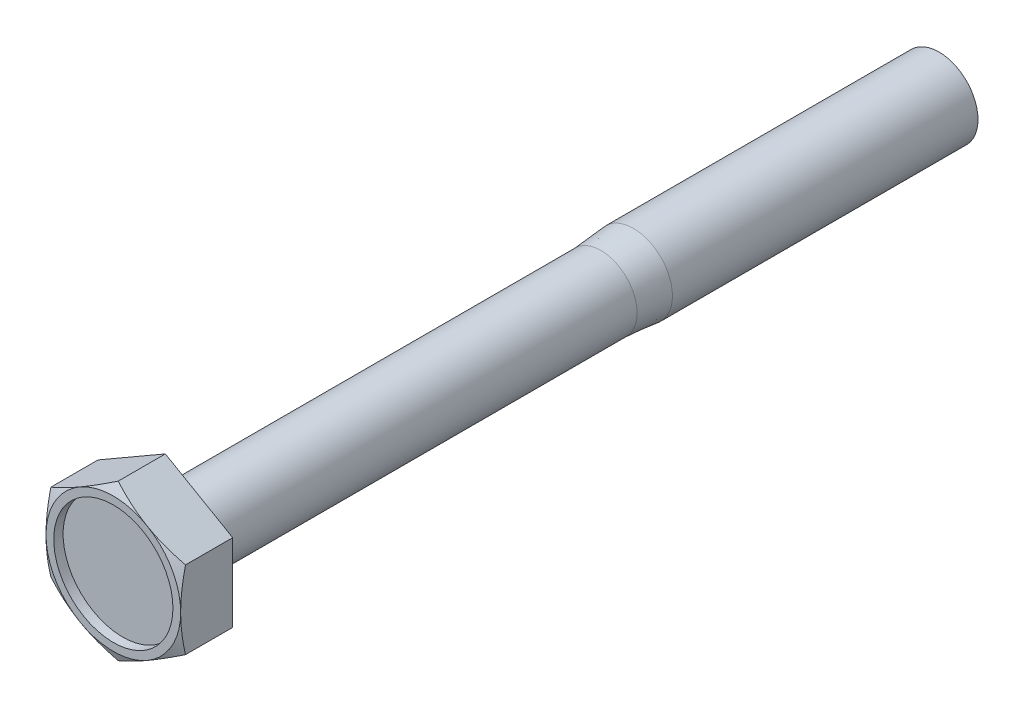
ISO-10303-21;
HEADER;
FILE_DESCRIPTION(('STEP AP214'),'2;1');
FILE_NAME('part.step','',(''),(''),'','','');
FILE_SCHEMA(('AUTOMOTIVE_DESIGN { 1 0 10303 214 1 1 1 1 }'));
ENDSEC;
DATA;
#1=APPLICATION_CONTEXT('core data for automotive mechanical design processes');
#2=APPLICATION_PROTOCOL_DEFINITION('international standard','automotive_design',2000,#1);
#3=PRODUCT_CONTEXT('',#1,'mechanical');
#4=PRODUCT('Part','Part','',(#3));
#5=PRODUCT_RELATED_PRODUCT_CATEGORY('part','',(#4));
#6=PRODUCT_DEFINITION_FORMATION('','',#4);
#7=PRODUCT_DEFINITION_CONTEXT('part definition',#1,'design');
#8=PRODUCT_DEFINITION('design','',#6,#7);
#9=PRODUCT_DEFINITION_SHAPE('','',#8);
#10=(LENGTH_UNIT() NAMED_UNIT(*) SI_UNIT(.MILLI.,.METRE.));
#11=(NAMED_UNIT(*) PLANE_ANGLE_UNIT() SI_UNIT($,.RADIAN.));
#12=(NAMED_UNIT(*) SI_UNIT($,.STERADIAN.) SOLID_ANGLE_UNIT());
#13=UNCERTAINTY_MEASURE_WITH_UNIT(LENGTH_MEASURE(1.E-05),#10,'distance_accuracy_value','');
#14=(GEOMETRIC_REPRESENTATION_CONTEXT(3) GLOBAL_UNCERTAINTY_ASSIGNED_CONTEXT((#13)) GLOBAL_UNIT_ASSIGNED_CONTEXT((#10,
#11,#12)) REPRESENTATION_CONTEXT('',''));
#15=CARTESIAN_POINT('',(0.,0.,0.));
#16=DIRECTION('',(0.,0.,1.));
#17=DIRECTION('',(1.,0.,0.));
#18=AXIS2_PLACEMENT_3D('',#15,#16,#17);
#19=CARTESIAN_POINT('',(2.58941595731547,-1.495,0.));
#20=DIRECTION('',(0.,0.,1.));
#21=DIRECTION('',(1.,0.,0.));
#22=AXIS2_PLACEMENT_3D('',#19,#20,#21);
#23=PLANE('',#22);
#24=CARTESIAN_POINT('',(0.,0.,0.));
#25=DIRECTION('',(0.,0.,1.));
#26=DIRECTION('',(1.,0.,0.));
#27=AXIS2_PLACEMENT_3D('',#24,#25,#26);
#28=CIRCLE('',#27,1.49175);
#29=CARTESIAN_POINT('',(1.49175,0.,0.));
#30=VERTEX_POINT('',#29);
#31=EDGE_CURVE('E12',#30,#30,#28,.T.);
#32=ORIENTED_EDGE('',*,*,#31,.T.);
#33=EDGE_LOOP('',(#32));
#34=FACE_BOUND('',#33,.T.);
#35=DIRECTION('',(0.866025403784439,0.5,0.));
#36=VECTOR('',#35,1.);
#37=CARTESIAN_POINT('',(0.,-2.99,0.));
#38=LINE('',#37,#36);
#39=CARTESIAN_POINT('',(0.,-2.99,0.));
#40=VERTEX_POINT('',#39);
#41=CARTESIAN_POINT('',(2.58941595731547,-1.495,0.));
#42=VERTEX_POINT('',#41);
#43=EDGE_CURVE('E228',#40,#42,#38,.T.);
#44=ORIENTED_EDGE('',*,*,#43,.F.);
#45=DIRECTION('',(0.866025403784439,-0.5,0.));
#46=VECTOR('',#45,1.);
#47=CARTESIAN_POINT('',(-2.58941595731547,-1.495,0.));
#48=LINE('',#47,#46);
#49=CARTESIAN_POINT('',(-2.58941595731547,-1.495,0.));
#50=VERTEX_POINT('',#49);
#51=EDGE_CURVE('E231',#50,#40,#48,.T.);
#52=ORIENTED_EDGE('',*,*,#51,.F.);
#53=DIRECTION('',(0.,-1.,0.));
#54=VECTOR('',#53,1.);
#55=CARTESIAN_POINT('',(-2.58941595731547,1.495,0.));
#56=LINE('',#55,#54);
#57=CARTESIAN_POINT('',(-2.58941595731547,1.495,0.));
#58=VERTEX_POINT('',#57);
#59=EDGE_CURVE('E244',#58,#50,#56,.T.);
#60=ORIENTED_EDGE('',*,*,#59,.F.);
#61=DIRECTION('',(-0.866025403784439,-0.5,0.));
#62=VECTOR('',#61,1.);
#63=CARTESIAN_POINT('',(0.,2.99,0.));
#64=LINE('',#63,#62);
#65=CARTESIAN_POINT('',(0.,2.99,0.));
#66=VERTEX_POINT('',#65);
#67=EDGE_CURVE('E241',#66,#58,#64,.T.);
#68=ORIENTED_EDGE('',*,*,#67,.F.);
#69=DIRECTION('',(-0.866025403784439,0.5,0.));
#70=VECTOR('',#69,1.);
#71=CARTESIAN_POINT('',(2.58941595731547,1.495,0.));
#72=LINE('',#71,#70);
#73=CARTESIAN_POINT('',(2.58941595731547,1.495,0.));
#74=VERTEX_POINT('',#73);
#75=EDGE_CURVE('E237',#74,#66,#72,.T.);
#76=ORIENTED_EDGE('',*,*,#75,.F.);
#77=DIRECTION('',(0.,1.,0.));
#78=VECTOR('',#77,1.);
#79=CARTESIAN_POINT('',(2.58941595731547,-1.495,0.));
#80=LINE('',#79,#78);
#81=EDGE_CURVE('E234',#42,#74,#80,.T.);
#82=ORIENTED_EDGE('',*,*,#81,.F.);
#83=EDGE_LOOP('',(#44,#52,#60,#68,#76,#82));
#84=FACE_BOUND('',#83,.T.);
#85=ADVANCED_FACE('F40',(#34,#84),#23,.F.);
#86=CARTESIAN_POINT('',(0.,-2.99,2.));
#87=DIRECTION('',(-0.5,0.866025403784439,0.));
#88=DIRECTION('',(-0.866025403784439,-0.5,0.));
#89=AXIS2_PLACEMENT_3D('',#86,#87,#88);
#90=PLANE('',#89);
#91=CARTESIAN_POINT('',(-0.000200000000000559,-2.99011547005384,1.81315074547213));
#92=CARTESIAN_POINT('',(0.0781117553372653,-2.94490215702915,1.83423550833601));
#93=CARTESIAN_POINT('',(0.156712474604209,-2.89952201060189,1.85396640188176));
#94=CARTESIAN_POINT('',(0.314503791686666,-2.80842115120854,1.89025045260236));
#95=CARTESIAN_POINT('',(0.393694684751058,-2.76270026778045,1.90680189036158));
#96=CARTESIAN_POINT('',(0.552668224565891,-2.67091685177433,1.93624704480983));
#97=CARTESIAN_POINT('',(0.632451356314811,-2.6248540391823,1.94913731924638));
#98=CARTESIAN_POINT('',(0.792426710600924,-2.53249222532151,1.97078431183186));
#99=CARTESIAN_POINT('',(0.87261885363393,-2.48619326995451,1.97954180452042));
#100=CARTESIAN_POINT('',(1.03161323694773,-2.39439781994865,1.99243942883411));
#101=CARTESIAN_POINT('',(1.11040981511753,-2.34890459433109,1.99667154484949));
#102=CARTESIAN_POINT('',(1.26809391755935,-2.25786563533938,2.00065967331986));
#103=CARTESIAN_POINT('',(1.34698144696711,-2.21231989900011,2.00041541924465));
#104=CARTESIAN_POINT('',(1.50457595498441,-2.12133266737351,1.99546312758893));
#105=CARTESIAN_POINT('',(1.58328303334731,-2.07589111449356,1.99075925095106));
#106=CARTESIAN_POINT('',(1.74040962017896,-1.98517403728946,1.97709025779556));
#107=CARTESIAN_POINT('',(1.81882915415107,-1.93989849824094,1.96812552887589));
#108=CARTESIAN_POINT('',(1.9550576715823,-1.86124692703071,1.94909903740903));
#109=CARTESIAN_POINT('',(2.01296101952873,-1.82781641350686,1.93991797122025));
#110=CARTESIAN_POINT('',(2.12850295257314,-1.76110824736099,1.91957254405888));
#111=CARTESIAN_POINT('',(2.1861415485515,-1.72783058845717,1.90840826535123));
#112=CARTESIAN_POINT('',(2.30159944284048,-1.66117094210936,1.88418163759496));
#113=CARTESIAN_POINT('',(2.35941641727062,-1.62779029635838,1.87110463321703));
#114=CARTESIAN_POINT('',(2.4747445600283,-1.5612055620921,1.84331084881179));
#115=CARTESIAN_POINT('',(2.53225577796,-1.52800144493781,1.82859434383544));
#116=CARTESIAN_POINT('',(2.58961595731547,-1.49488452994616,1.81315074547213));
#117=B_SPLINE_CURVE_WITH_KNOTS('',3,(#91,#92,#93,#94,#95,#96,#97,#98,#99,#100,#101,#102,#103,
#104,#105,#106,#107,#108,#109,#110,#111,#112,#113,#114,#115,#116),.UNSPECIFIED.,.F.,.F.,(4,2,2,
2,2,2,2,2,2,2,2,2,4),(0.,0.278572599021923,0.557295425608173,0.836279448440925,1.11521116508063,
1.38835866824515,1.6615224350996,1.93443158369264,2.20731591124514,2.40975158276458,
2.61217885908091,2.81624738167224,3.02028172009845),.UNSPECIFIED.);
#118=CARTESIAN_POINT('',(0.,-2.99,1.81320459316152));
#119=VERTEX_POINT('',#118);
#120=CARTESIAN_POINT('',(1.29470797865774,-2.2425,2.));
#121=VERTEX_POINT('',#120);
#122=EDGE_CURVE('E236',#119,#121,#117,.T.);
#123=ORIENTED_EDGE('',*,*,#122,.F.);
#124=DIRECTION('',(0.,0.,-1.));
#125=VECTOR('',#124,1.);
#126=CARTESIAN_POINT('',(0.,-2.99,2.));
#127=LINE('',#126,#125);
#128=EDGE_CURVE('E248',#119,#40,#127,.T.);
#129=ORIENTED_EDGE('',*,*,#128,.T.);
#130=ORIENTED_EDGE('',*,*,#43,.T.);
#131=DIRECTION('',(0.,0.,-1.));
#132=VECTOR('',#131,1.);
#133=CARTESIAN_POINT('',(2.58941595731547,-1.495,2.));
#134=LINE('',#133,#132);
#135=CARTESIAN_POINT('',(2.58941595731547,-1.49500000000002,1.81320459316154));
#136=VERTEX_POINT('',#135);
#137=EDGE_CURVE('E257',#136,#42,#134,.T.);
#138=ORIENTED_EDGE('',*,*,#137,.F.);
#139=EDGE_CURVE('E178',#121,#136,#117,.T.);
#140=ORIENTED_EDGE('',*,*,#139,.F.);
#141=EDGE_LOOP('',(#123,#129,#130,#138,#140));
#142=FACE_BOUND('',#141,.T.);
#143=ADVANCED_FACE('F216',(#142),#90,.F.);
#144=CARTESIAN_POINT('',(2.58941595731547,-1.495,2.));
#145=DIRECTION('',(-1.,0.,0.));
#146=DIRECTION('',(0.,-1.,0.));
#147=AXIS2_PLACEMENT_3D('',#144,#145,#146);
#148=PLANE('',#147);
#149=CARTESIAN_POINT('',(2.58941595731547,-4.05949187050648,0.962177416281556));
#150=CARTESIAN_POINT('',(2.58941595731547,-3.94192425881493,1.00838483216717));
#151=CARTESIAN_POINT('',(2.58941595731547,-3.82416444986135,1.05411185272814));
#152=CARTESIAN_POINT('',(2.58941595731547,-3.58816211272699,1.14433123663302));
#153=CARTESIAN_POINT('',(2.58941595731547,-3.4699195451137,1.18882349670777));
#154=CARTESIAN_POINT('',(2.58941595731547,-3.23251482185504,1.27642383820413));
#155=CARTESIAN_POINT('',(2.58941595731547,-3.1133509671602,1.31952733109694));
#156=CARTESIAN_POINT('',(2.58941595731547,-2.87434625236034,1.40382271549667));
#157=CARTESIAN_POINT('',(2.58941595731547,-2.75450539046578,1.44501460194796));
#158=CARTESIAN_POINT('',(2.58941595731547,-2.51587025363248,1.52437224505162));
#159=CARTESIAN_POINT('',(2.58941595731547,-2.39708829290789,1.56257484180808));
#160=CARTESIAN_POINT('',(2.58941595731547,-2.15861570305668,1.63602300676433));
#161=CARTESIAN_POINT('',(2.58941595731547,-2.03892512580186,1.67126874240381));
#162=CARTESIAN_POINT('',(2.58941595731547,-1.79860608947482,1.73798468167914));
#163=CARTESIAN_POINT('',(2.58941595731547,-1.67797862676659,1.76945843184286));
#164=CARTESIAN_POINT('',(2.58941595731547,-1.43555387668353,1.82770703865638));
#165=CARTESIAN_POINT('',(2.58941595731547,-1.31375625194185,1.85448049451254));
#166=CARTESIAN_POINT('',(2.58941595731547,-1.02368725831387,1.91100450904459));
#167=CARTESIAN_POINT('',(2.58941595731547,-0.854889983062962,1.93819312846918));
#168=CARTESIAN_POINT('',(2.58941595731547,-0.600503304155968,1.9685472343523));
#169=CARTESIAN_POINT('',(2.58941595731547,-0.515522442730212,1.97692664525511));
#170=CARTESIAN_POINT('',(2.58941595731547,-0.345278080402542,1.98994142195949));
#171=CARTESIAN_POINT('',(2.58941595731547,-0.260014614488341,1.99457723503932));
#172=CARTESIAN_POINT('',(2.58941595731547,-0.0888523157621135,1.99994961267286));
#173=CARTESIAN_POINT('',(2.58941595731547,-0.00295273896992577,2.00066262774147));
#174=CARTESIAN_POINT('',(2.58941595731547,0.168783937451278,1.99809962511386));
#175=CARTESIAN_POINT('',(2.58941595731547,0.254621038601308,1.99482370801898));
#176=CARTESIAN_POINT('',(2.58941595731547,0.426075303303482,1.9844054623946));
#177=CARTESIAN_POINT('',(2.58941595731547,0.511692420367339,1.97726237490939));
#178=CARTESIAN_POINT('',(2.58941595731547,0.682531233082829,1.95936225508539));
#179=CARTESIAN_POINT('',(2.58941595731547,0.767752970102243,1.94860560988405));
#180=CARTESIAN_POINT('',(2.58941595731547,1.14528354421324,1.89354263045641));
#181=CARTESIAN_POINT('',(2.58941595731547,1.43504432812931,1.83145796907614));
#182=CARTESIAN_POINT('',(2.58941595731547,1.86488669512967,1.72049094983876));
#183=CARTESIAN_POINT('',(2.58941595731547,2.0075340805957,1.68047048460236));
#184=CARTESIAN_POINT('',(2.58941595731547,2.29148742048406,1.59589666765467));
#185=CARTESIAN_POINT('',(2.58941595731547,2.43279355681267,1.55134394051782));
#186=CARTESIAN_POINT('',(2.58941595731547,2.71546676566653,1.45842517393483));
#187=CARTESIAN_POINT('',(2.58941595731547,2.85682401182303,1.41002976487161));
#188=CARTESIAN_POINT('',(2.58941595731547,3.13860785576299,1.31059159760953));
#189=CARTESIAN_POINT('',(2.58941595731547,3.27903442266437,1.25954875205375));
#190=CARTESIAN_POINT('',(2.58941595731547,3.55898916615624,1.1554805902979));
#191=CARTESIAN_POINT('',(2.58941595731547,3.69851809464803,1.10245728719732));
#192=CARTESIAN_POINT('',(2.58941595731547,3.97696309955221,0.994822558189772));
#193=CARTESIAN_POINT('',(2.58941595731547,4.11587916599807,0.940211106564708));
#194=CARTESIAN_POINT('',(2.58941595731547,4.53143813396891,0.774690977784609));
#195=CARTESIAN_POINT('',(2.58941595731547,4.80734109769616,0.661926825284794));
#196=CARTESIAN_POINT('',(2.58941595731547,5.35788393487722,0.433167457152506));
#197=CARTESIAN_POINT('',(2.58941595731547,5.63252344094687,0.317171363366641));
#198=CARTESIAN_POINT('',(2.58941595731547,6.17596158226178,0.0850893691332576));
#199=CARTESIAN_POINT('',(2.58941595731547,6.4447767985795,-0.0309577858859056));
#200=CARTESIAN_POINT('',(2.58941595731547,6.98164615260976,-0.264556403945473));
#201=CARTESIAN_POINT('',(2.58941595731547,7.24970051548374,-0.382107349017134));
#202=CARTESIAN_POINT('',(2.58941595731547,7.51753495297041,-0.500147868118493));
#203=B_SPLINE_CURVE_WITH_KNOTS('',3,(#149,#150,#151,#152,#153,#154,#155,#156,#157,#158,#159,
#160,#161,#162,#163,#164,#165,#166,#167,#168,#169,#170,#171,#172,#173,#174,#175,#176,#177,#178,
#179,#180,#181,#182,#183,#184,#185,#186,#187,#188,#189,#190,#191,#192,#193,#194,#195,#196,#197,
#198,#199,#200,#201,#202),.UNSPECIFIED.,.F.,.F.,(4,2,2,2,2,2,2,2,2,2,2,2,2,2,2,2,2,2,2,2,2,2,2,
2,2,2,4),(0.,0.378969910717856,0.757971421636924,1.13811809538307,1.51826577444642,
1.89255771405653,2.26682844411885,2.64074446654391,3.01477173589597,3.52714867958541,
3.78325839827987,4.03933751292185,4.29695226727309,4.55456052468475,4.81221935762173,
5.06985059515373,5.95667460818366,6.40114264268393,6.84554950943012,7.29375936304856,
7.74198401557597,8.18976483395494,8.6375529076346,9.53168848061554,10.4260694157637,
11.3044469245205,12.1825296204247),.UNSPECIFIED.);
#204=CARTESIAN_POINT('',(2.58941595731547,0.,2.));
#205=VERTEX_POINT('',#204);
#206=EDGE_CURVE('E340',#136,#205,#203,.T.);
#207=ORIENTED_EDGE('',*,*,#206,.F.);
#208=ORIENTED_EDGE('',*,*,#137,.T.);
#209=ORIENTED_EDGE('',*,*,#81,.T.);
#210=DIRECTION('',(0.,0.,-1.));
#211=VECTOR('',#210,1.);
#212=CARTESIAN_POINT('',(2.58941595731547,1.495,2.));
#213=LINE('',#212,#211);
#214=CARTESIAN_POINT('',(2.58941595731547,1.495,1.81320459316152));
#215=VERTEX_POINT('',#214);
#216=EDGE_CURVE('E255',#215,#74,#213,.T.);
#217=ORIENTED_EDGE('',*,*,#216,.F.);
#218=EDGE_CURVE('E116',#205,#215,#203,.T.);
#219=ORIENTED_EDGE('',*,*,#218,.F.);
#220=EDGE_LOOP('',(#207,#208,#209,#217,#219));
#221=FACE_BOUND('',#220,.T.);
#222=ADVANCED_FACE('F214',(#221),#148,.F.);
#223=CARTESIAN_POINT('',(2.58941595731547,1.495,2.));
#224=DIRECTION('',(-0.5,-0.866025403784439,0.));
#225=DIRECTION('',(0.866025403784439,-0.5,0.));
#226=AXIS2_PLACEMENT_3D('',#223,#224,#225);
#227=PLANE('',#226);
#228=CARTESIAN_POINT('',(2.58961595731547,1.49488452994616,1.81315074547213));
#229=CARTESIAN_POINT('',(2.51130420197821,1.54009784297085,1.83423550833601));
#230=CARTESIAN_POINT('',(2.43270348271126,1.58547798939812,1.85396640188176));
#231=CARTESIAN_POINT('',(2.2749121656288,1.67657884879146,1.89025045260236));
#232=CARTESIAN_POINT('',(2.19572127256441,1.72229973221955,1.90680189036158));
#233=CARTESIAN_POINT('',(2.03674773274958,1.81408314822567,1.93624704480983));
#234=CARTESIAN_POINT('',(1.95696460100066,1.8601459608177,1.94913731924638));
#235=CARTESIAN_POINT('',(1.79698924671455,1.9525077746785,1.97078431183186));
#236=CARTESIAN_POINT('',(1.71679710368154,1.99880673004549,1.97954180452042));
#237=CARTESIAN_POINT('',(1.55780272036774,2.09060218005135,1.99243942883411));
#238=CARTESIAN_POINT('',(1.47900614219794,2.13609540566891,1.99667154484949));
#239=CARTESIAN_POINT('',(1.32132203975612,2.22713436466062,2.00065967331986));
#240=CARTESIAN_POINT('',(1.24243451034836,2.2726801009999,2.00041541924465));
#241=CARTESIAN_POINT('',(1.08484000233106,2.36366733262649,1.99546312758893));
#242=CARTESIAN_POINT('',(1.00613292396816,2.40910888550644,1.99075925095106));
#243=CARTESIAN_POINT('',(0.849006337136511,2.49982596271054,1.97709025779556));
#244=CARTESIAN_POINT('',(0.770586803164397,2.54510150175906,1.96812552887589));
#245=CARTESIAN_POINT('',(0.634358285733167,2.62375307296929,1.94909903740903));
#246=CARTESIAN_POINT('',(0.576454937786736,2.65718358649314,1.93991797122025));
#247=CARTESIAN_POINT('',(0.460913004742333,2.72389175263902,1.91957254405888));
#248=CARTESIAN_POINT('',(0.403274408763974,2.75716941154283,1.90840826535123));
#249=CARTESIAN_POINT('',(0.28781651447499,2.82382905789065,1.88418163759496));
#250=CARTESIAN_POINT('',(0.229999540044849,2.85720970364162,1.87110463321703));
#251=CARTESIAN_POINT('',(0.114671397287173,2.9237944379079,1.84331084881178));
#252=CARTESIAN_POINT('',(0.0571601793554716,2.95699855506219,1.82859434383544));
#253=CARTESIAN_POINT('',(-0.000200000000000025,2.99011547005384,1.81315074547213));
#254=B_SPLINE_CURVE_WITH_KNOTS('',3,(#228,#229,#230,#231,#232,#233,#234,#235,#236,#237,#238,
#239,#240,#241,#242,#243,#244,#245,#246,#247,#248,#249,#250,#251,#252,#253),.UNSPECIFIED.,.F.,
.F.,(4,2,2,2,2,2,2,2,2,2,2,2,4),(0.,0.278572599021923,0.557295425608173,0.836279448440926,
1.11521116508063,1.38835866824515,1.6615224350996,1.93443158369264,2.20731591124514,
2.40975158276458,2.61217885908091,2.81624738167224,3.02028172009845),.UNSPECIFIED.);
#255=CARTESIAN_POINT('',(1.29470797865774,2.2425,2.));
#256=VERTEX_POINT('',#255);
#257=EDGE_CURVE('E112',#215,#256,#254,.T.);
#258=ORIENTED_EDGE('',*,*,#257,.F.);
#259=ORIENTED_EDGE('',*,*,#216,.T.);
#260=ORIENTED_EDGE('',*,*,#75,.T.);
#261=DIRECTION('',(0.,0.,-1.));
#262=VECTOR('',#261,1.);
#263=CARTESIAN_POINT('',(0.,2.99,2.));
#264=LINE('',#263,#262);
#265=CARTESIAN_POINT('',(0.,2.99,1.81320459316152));
#266=VERTEX_POINT('',#265);
#267=EDGE_CURVE('E142',#266,#66,#264,.T.);
#268=ORIENTED_EDGE('',*,*,#267,.F.);
#269=EDGE_CURVE('E120',#256,#266,#254,.T.);
#270=ORIENTED_EDGE('',*,*,#269,.F.);
#271=EDGE_LOOP('',(#258,#259,#260,#268,#270));
#272=FACE_BOUND('',#271,.T.);
#273=ADVANCED_FACE('F140',(#272),#227,.F.);
#274=CARTESIAN_POINT('',(0.,2.99,2.));
#275=DIRECTION('',(0.5,-0.866025403784439,0.));
#276=DIRECTION('',(0.866025403784439,0.5,0.));
#277=AXIS2_PLACEMENT_3D('',#274,#275,#276);
#278=PLANE('',#277);
#279=CARTESIAN_POINT('',(0.000200000000000231,2.99011547005384,1.81315074547213));
#280=CARTESIAN_POINT('',(-0.0781117553372655,2.94490215702916,1.83423550833601));
#281=CARTESIAN_POINT('',(-0.156712474604209,2.89952201060189,1.85396640188176));
#282=CARTESIAN_POINT('',(-0.314503791686666,2.80842115120855,1.89025045260236));
#283=CARTESIAN_POINT('',(-0.393694684751058,2.76270026778045,1.90680189036158));
#284=CARTESIAN_POINT('',(-0.552668224565891,2.67091685177433,1.93624704480983));
#285=CARTESIAN_POINT('',(-0.632451356314811,2.6248540391823,1.94913731924638));
#286=CARTESIAN_POINT('',(-0.792426710600925,2.53249222532151,1.97078431183186));
#287=CARTESIAN_POINT('',(-0.872618853633931,2.48619326995451,1.97954180452042));
#288=CARTESIAN_POINT('',(-1.03161323694773,2.39439781994865,1.99243942883411));
#289=CARTESIAN_POINT('',(-1.11040981511753,2.34890459433109,1.99667154484949));
#290=CARTESIAN_POINT('',(-1.26809391755935,2.25786563533938,2.00065967331986));
#291=CARTESIAN_POINT('',(-1.34698144696711,2.21231989900011,2.00041541924465));
#292=CARTESIAN_POINT('',(-1.50457595498441,2.12133266737352,1.99546312758893));
#293=CARTESIAN_POINT('',(-1.58328303334732,2.07589111449356,1.99075925095106));
#294=CARTESIAN_POINT('',(-1.74040962017896,1.98517403728946,1.97709025779556));
#295=CARTESIAN_POINT('',(-1.81882915415107,1.93989849824094,1.96812552887589));
#296=CARTESIAN_POINT('',(-1.9550576715823,1.86124692703072,1.94909903740903));
#297=CARTESIAN_POINT('',(-2.01296101952874,1.82781641350686,1.93991797122025));
#298=CARTESIAN_POINT('',(-2.12850295257314,1.76110824736099,1.91957254405888));
#299=CARTESIAN_POINT('',(-2.1861415485515,1.72783058845717,1.90840826535123));
#300=CARTESIAN_POINT('',(-2.30159944284048,1.66117094210936,1.88418163759496));
#301=CARTESIAN_POINT('',(-2.35941641727062,1.62779029635839,1.87110463321703));
#302=CARTESIAN_POINT('',(-2.4747445600283,1.5612055620921,1.84331084881178));
#303=CARTESIAN_POINT('',(-2.53225577796,1.52800144493781,1.82859434383544));
#304=CARTESIAN_POINT('',(-2.58961595731547,1.49488452994616,1.81315074547213));
#305=B_SPLINE_CURVE_WITH_KNOTS('',3,(#279,#280,#281,#282,#283,#284,#285,#286,#287,#288,#289,
#290,#291,#292,#293,#294,#295,#296,#297,#298,#299,#300,#301,#302,#303,#304),.UNSPECIFIED.,.F.,
.F.,(4,2,2,2,2,2,2,2,2,2,2,2,4),(0.,0.278572599021923,0.557295425608173,0.836279448440926,
1.11521116508063,1.38835866824515,1.6615224350996,1.93443158369264,2.20731591124514,
2.40975158276458,2.61217885908092,2.81624738167224,3.02028172009845),.UNSPECIFIED.);
#306=CARTESIAN_POINT('',(-1.29470797865774,2.2425,2.));
#307=VERTEX_POINT('',#306);
#308=EDGE_CURVE('E127',#266,#307,#305,.T.);
#309=ORIENTED_EDGE('',*,*,#308,.F.);
#310=ORIENTED_EDGE('',*,*,#267,.T.);
#311=ORIENTED_EDGE('',*,*,#67,.T.);
#312=DIRECTION('',(0.,0.,-1.));
#313=VECTOR('',#312,1.);
#314=CARTESIAN_POINT('',(-2.58941595731547,1.495,2.));
#315=LINE('',#314,#313);
#316=CARTESIAN_POINT('',(-2.58941595731547,1.495,1.81320459316152));
#317=VERTEX_POINT('',#316);
#318=EDGE_CURVE('E252',#317,#58,#315,.T.);
#319=ORIENTED_EDGE('',*,*,#318,.F.);
#320=EDGE_CURVE('E143',#307,#317,#305,.T.);
#321=ORIENTED_EDGE('',*,*,#320,.F.);
#322=EDGE_LOOP('',(#309,#310,#311,#319,#321));
#323=FACE_BOUND('',#322,.T.);
#324=ADVANCED_FACE('F205',(#323),#278,.F.);
#325=CARTESIAN_POINT('',(-2.58941595731547,1.495,2.));
#326=DIRECTION('',(1.,0.,0.));
#327=DIRECTION('',(0.,0.,-1.));
#328=AXIS2_PLACEMENT_3D('',#325,#326,#327);
#329=PLANE('',#328);
#330=CARTESIAN_POINT('',(-2.58941595731547,-4.05949186860814,0.962177417027866));
#331=CARTESIAN_POINT('',(-2.58941595731547,-3.94192425698689,1.00838483287961));
#332=CARTESIAN_POINT('',(-2.58941595731547,-3.82416444810366,1.05411185340676));
#333=CARTESIAN_POINT('',(-2.58941595731547,-3.5881621111102,1.1443312372443));
#334=CARTESIAN_POINT('',(-2.58941595731547,-3.46991954356746,1.18882349728553));
#335=CARTESIAN_POINT('',(-2.58941595731547,-3.23251482045085,1.27642383871505));
#336=CARTESIAN_POINT('',(-2.58941595731547,-3.11335096582753,1.31952733157456));
#337=CARTESIAN_POINT('',(-2.58941595731547,-2.8743462511711,1.40382271590851));
#338=CARTESIAN_POINT('',(-2.58941595731547,-2.75450538934847,1.44501460232732));
#339=CARTESIAN_POINT('',(-2.58941595731547,-2.51587025265897,1.52437224536768));
#340=CARTESIAN_POINT('',(-2.58941595731547,-2.39708829200627,1.56257484209331));
#341=CARTESIAN_POINT('',(-2.58941595731547,-2.15861570229962,1.63602300698996));
#342=CARTESIAN_POINT('',(-2.58941595731547,-2.0389251251175,1.67126874260066));
#343=CARTESIAN_POINT('',(-2.58941595731547,-1.79860608893666,1.73798468182169));
#344=CARTESIAN_POINT('',(-2.58941595731547,-1.67797862630193,1.76945843195987));
#345=CARTESIAN_POINT('',(-2.58941595731547,-1.43555387636721,1.82770703872702));
#346=CARTESIAN_POINT('',(-2.58941595731547,-1.31375625170039,1.85448049456235));
#347=CARTESIAN_POINT('',(-2.58941595731547,-1.02368725811303,1.91100450907998));
#348=CARTESIAN_POINT('',(-2.58941595731547,-0.854889982826672,1.93819312850486));
#349=CARTESIAN_POINT('',(-2.58941595731547,-0.600503303866358,1.9685472343831));
#350=CARTESIAN_POINT('',(-2.58941595731547,-0.515522442422803,1.9769266452834));
#351=CARTESIAN_POINT('',(-2.58941595731547,-0.345278080059608,1.98994142198092));
#352=CARTESIAN_POINT('',(-2.58941595731547,-0.260014614127681,1.99457723505642));
#353=CARTESIAN_POINT('',(-2.58941595731547,-0.0888523153654089,1.9999496126795));
#354=CARTESIAN_POINT('',(-2.58941595731547,-0.00295273855490324,2.00066262774196));
#355=CARTESIAN_POINT('',(-2.58941595731547,0.168783937902589,1.99809962510044));
#356=CARTESIAN_POINT('',(-2.58941595731547,0.25462103907059,1.99482370799779));
#357=CARTESIAN_POINT('',(-2.58941595731547,0.426075303808422,1.98440546235659));
#358=CARTESIAN_POINT('',(-2.58941595731547,0.511692420889966,1.97726237486232));
#359=CARTESIAN_POINT('',(-2.58941595731547,0.682531233640411,1.95936225501927));
#360=CARTESIAN_POINT('',(-2.58941595731547,0.767752970677093,1.94860560980795));
#361=CARTESIAN_POINT('',(-2.58941595731547,1.14528354480664,1.8935426303432));
#362=CARTESIAN_POINT('',(-2.58941595731547,1.43504432872298,1.83145796894066));
#363=CARTESIAN_POINT('',(-2.58941595731547,1.86488669572438,1.72049094967633));
#364=CARTESIAN_POINT('',(-2.58941595731547,2.00753408119078,1.68047048443205));
#365=CARTESIAN_POINT('',(-2.58941595731547,2.29148742108011,1.59589666747021));
#366=CARTESIAN_POINT('',(-2.58941595731547,2.43279355740933,1.55134394032709));
#367=CARTESIAN_POINT('',(-2.58941595731547,2.71546676626386,1.45842517373303));
#368=CARTESIAN_POINT('',(-2.58941595731547,2.85682401242042,1.41002976466503));
#369=CARTESIAN_POINT('',(-2.58941595731547,3.13860785636076,1.31059159739435));
#370=CARTESIAN_POINT('',(-2.58941595731547,3.27903442326246,1.25954875183475));
#371=CARTESIAN_POINT('',(-2.58941595731547,3.55898916675524,1.15548059007192));
#372=CARTESIAN_POINT('',(-2.58941595731547,3.69851809524761,1.10245728696818));
#373=CARTESIAN_POINT('',(-2.58941595731547,3.97696310015316,0.994822557954846));
#374=CARTESIAN_POINT('',(-2.58941595731547,4.11587916659978,0.940211106327144));
#375=CARTESIAN_POINT('',(-2.58941595731547,4.53143813455558,0.774690977546692));
#376=CARTESIAN_POINT('',(-2.58941595731547,4.80734109826735,0.661926825050042));
#377=CARTESIAN_POINT('',(-2.58941595731547,5.35788393541789,0.433167456925289));
#378=CARTESIAN_POINT('',(-2.58941595731547,5.63252344147249,0.317171363143796));
#379=CARTESIAN_POINT('',(-2.58941595731547,6.17596158276131,0.0850893689183169));
#380=CARTESIAN_POINT('',(-2.58941595731547,6.44477679906798,-0.0309577860973536));
#381=CARTESIAN_POINT('',(-2.58941595731547,6.98164615307634,-0.264556404149534));
#382=CARTESIAN_POINT('',(-2.58941595731547,7.24970051593948,-0.382107349217301));
#383=CARTESIAN_POINT('',(-2.58941595731547,7.51753495341535,-0.500147868314663));
#384=B_SPLINE_CURVE_WITH_KNOTS('',3,(#330,#331,#332,#333,#334,#335,#336,#337,#338,#339,#340,
#341,#342,#343,#344,#345,#346,#347,#348,#349,#350,#351,#352,#353,#354,#355,#356,#357,#358,#359,
#360,#361,#362,#363,#364,#365,#366,#367,#368,#369,#370,#371,#372,#373,#374,#375,#376,#377,#378,
#379,#380,#381,#382,#383),.UNSPECIFIED.,.F.,.F.,(4,2,2,2,2,2,2,2,2,2,2,2,2,2,2,2,2,2,2,2,2,2,2,
2,2,2,4),(0.,0.378969910484387,0.757971421169957,1.13811809468038,1.518265773508,
1.89255771288454,2.26682844271332,2.64074446490577,3.01477173402528,3.52714867781939,
3.78325839656619,4.0393375112605,4.29695226566648,4.55456052313285,4.81221935612494,
5.06985059371207,5.95667460675802,6.40114264126575,6.84554950801941,7.29375936164268,
7.74198401417491,8.18976483255893,8.63755290624361,9.53168847917801,10.4260694142795,
11.3044469230016,12.1825296188714),.UNSPECIFIED.);
#385=CARTESIAN_POINT('',(-2.58941595731547,0.,2.));
#386=VERTEX_POINT('',#385);
#387=EDGE_CURVE('E199',#317,#386,#384,.F.);
#388=ORIENTED_EDGE('',*,*,#387,.F.);
#389=ORIENTED_EDGE('',*,*,#318,.T.);
#390=ORIENTED_EDGE('',*,*,#59,.T.);
#391=DIRECTION('',(0.,0.,-1.));
#392=VECTOR('',#391,1.);
#393=CARTESIAN_POINT('',(-2.58941595731547,-1.495,2.));
#394=LINE('',#393,#392);
#395=CARTESIAN_POINT('',(-2.58941595731547,-1.495,1.81320459316152));
#396=VERTEX_POINT('',#395);
#397=EDGE_CURVE('E250',#396,#50,#394,.T.);
#398=ORIENTED_EDGE('',*,*,#397,.F.);
#399=EDGE_CURVE('E193',#386,#396,#384,.F.);
#400=ORIENTED_EDGE('',*,*,#399,.F.);
#401=EDGE_LOOP('',(#388,#389,#390,#398,#400));
#402=FACE_BOUND('',#401,.T.);
#403=ADVANCED_FACE('F201',(#402),#329,.F.);
#404=CARTESIAN_POINT('',(-2.58941595731547,-1.495,2.));
#405=DIRECTION('',(0.5,0.866025403784439,0.));
#406=DIRECTION('',(-0.866025403784439,0.5,0.));
#407=AXIS2_PLACEMENT_3D('',#404,#405,#406);
#408=PLANE('',#407);
#409=CARTESIAN_POINT('',(-2.58961595731547,-1.49488452994616,1.81315074547213));
#410=CARTESIAN_POINT('',(-2.51130420197821,-1.54009784297085,1.83423550833601));
#411=CARTESIAN_POINT('',(-2.43270348271126,-1.58547798939811,1.85396640188176));
#412=CARTESIAN_POINT('',(-2.2749121656288,-1.67657884879146,1.89025045260236));
#413=CARTESIAN_POINT('',(-2.19572127256441,-1.72229973221955,1.90680189036158));
#414=CARTESIAN_POINT('',(-2.03674773274958,-1.81408314822567,1.93624704480983));
#415=CARTESIAN_POINT('',(-1.95696460100066,-1.8601459608177,1.94913731924638));
#416=CARTESIAN_POINT('',(-1.79698924671455,-1.95250777467849,1.97078431183186));
#417=CARTESIAN_POINT('',(-1.71679710368154,-1.99880673004549,1.97954180452042));
#418=CARTESIAN_POINT('',(-1.55780272036774,-2.09060218005135,1.99243942883411));
#419=CARTESIAN_POINT('',(-1.47900614219794,-2.13609540566891,1.99667154484949));
#420=CARTESIAN_POINT('',(-1.32132203975612,-2.22713436466062,2.00065967331986));
#421=CARTESIAN_POINT('',(-1.24243451034836,-2.27268010099989,2.00041541924465));
#422=CARTESIAN_POINT('',(-1.08484000233107,-2.36366733262649,1.99546312758893));
#423=CARTESIAN_POINT('',(-1.00613292396816,-2.40910888550644,1.99075925095106));
#424=CARTESIAN_POINT('',(-0.849006337136511,-2.49982596271054,1.97709025779556));
#425=CARTESIAN_POINT('',(-0.770586803164397,-2.54510150175906,1.96812552887589));
#426=CARTESIAN_POINT('',(-0.634358285733168,-2.62375307296929,1.94909903740903));
#427=CARTESIAN_POINT('',(-0.576454937786736,-2.65718358649314,1.93991797122025));
#428=CARTESIAN_POINT('',(-0.460913004742333,-2.72389175263901,1.91957254405888));
#429=CARTESIAN_POINT('',(-0.403274408763975,-2.75716941154283,1.90840826535123));
#430=CARTESIAN_POINT('',(-0.28781651447499,-2.82382905789064,1.88418163759496));
#431=CARTESIAN_POINT('',(-0.229999540044849,-2.85720970364162,1.87110463321703));
#432=CARTESIAN_POINT('',(-0.114671397287174,-2.9237944379079,1.84331084881179));
#433=CARTESIAN_POINT('',(-0.0571601793554719,-2.95699855506219,1.82859434383544));
#434=CARTESIAN_POINT('',(0.000199999999999698,-2.99011547005384,1.81315074547213));
#435=B_SPLINE_CURVE_WITH_KNOTS('',3,(#409,#410,#411,#412,#413,#414,#415,#416,#417,#418,#419,
#420,#421,#422,#423,#424,#425,#426,#427,#428,#429,#430,#431,#432,#433,#434),.UNSPECIFIED.,.F.,
.F.,(4,2,2,2,2,2,2,2,2,2,2,2,4),(0.,0.278572599021923,0.557295425608174,0.836279448440927,
1.11521116508063,1.38835866824515,1.6615224350996,1.93443158369264,2.20731591124514,
2.40975158276458,2.61217885908092,2.81624738167224,3.02028172009845),.UNSPECIFIED.);
#436=CARTESIAN_POINT('',(-1.29470797865773,-2.2425,2.));
#437=VERTEX_POINT('',#436);
#438=EDGE_CURVE('E200',#396,#437,#435,.T.);
#439=ORIENTED_EDGE('',*,*,#438,.F.);
#440=ORIENTED_EDGE('',*,*,#397,.T.);
#441=ORIENTED_EDGE('',*,*,#51,.T.);
#442=ORIENTED_EDGE('',*,*,#128,.F.);
#443=EDGE_CURVE('E136',#437,#119,#435,.T.);
#444=ORIENTED_EDGE('',*,*,#443,.F.);
#445=EDGE_LOOP('',(#439,#440,#441,#442,#444));
#446=FACE_BOUND('',#445,.T.);
#447=ADVANCED_FACE('F204',(#446),#408,.F.);
#448=CARTESIAN_POINT('',(0.,0.,2.));
#449=DIRECTION('',(0.,0.,-1.));
#450=DIRECTION('',(1.,0.,0.));
#451=AXIS2_PLACEMENT_3D('',#448,#449,#450);
#452=CONICAL_SURFACE('',#451,2.58941595731547,1.13446401379632);
#453=ORIENTED_EDGE('',*,*,#139,.T.);
#454=ORIENTED_EDGE('',*,*,#206,.T.);
#455=CARTESIAN_POINT('',(0.,0.,2.));
#456=DIRECTION('',(0.,0.,1.));
#457=DIRECTION('',(1.,0.,0.));
#458=AXIS2_PLACEMENT_3D('',#455,#456,#457);
#459=CIRCLE('',#458,2.58941595731547);
#460=EDGE_CURVE('E132',#121,#205,#459,.T.);
#461=ORIENTED_EDGE('',*,*,#460,.F.);
#462=EDGE_LOOP('',(#453,#454,#461));
#463=FACE_BOUND('',#462,.T.);
#464=ADVANCED_FACE('F171',(#463),#452,.T.);
#465=ORIENTED_EDGE('',*,*,#122,.T.);
#466=EDGE_CURVE('E258',#437,#121,#459,.T.);
#467=ORIENTED_EDGE('',*,*,#466,.F.);
#468=ORIENTED_EDGE('',*,*,#443,.T.);
#469=EDGE_LOOP('',(#465,#467,#468));
#470=FACE_BOUND('',#469,.T.);
#471=ADVANCED_FACE('F165',(#470),#452,.T.);
#472=ORIENTED_EDGE('',*,*,#399,.T.);
#473=ORIENTED_EDGE('',*,*,#438,.T.);
#474=EDGE_CURVE('E64',#386,#437,#459,.T.);
#475=ORIENTED_EDGE('',*,*,#474,.F.);
#476=EDGE_LOOP('',(#472,#473,#475));
#477=FACE_BOUND('',#476,.T.);
#478=ADVANCED_FACE('F170',(#477),#452,.T.);
#479=ORIENTED_EDGE('',*,*,#320,.T.);
#480=ORIENTED_EDGE('',*,*,#387,.T.);
#481=EDGE_CURVE('E130',#307,#386,#459,.T.);
#482=ORIENTED_EDGE('',*,*,#481,.F.);
#483=EDGE_LOOP('',(#479,#480,#482));
#484=FACE_BOUND('',#483,.T.);
#485=ADVANCED_FACE('F331',(#484),#452,.T.);
#486=ORIENTED_EDGE('',*,*,#269,.T.);
#487=ORIENTED_EDGE('',*,*,#308,.T.);
#488=EDGE_CURVE('E124',#256,#307,#459,.T.);
#489=ORIENTED_EDGE('',*,*,#488,.F.);
#490=EDGE_LOOP('',(#486,#487,#489));
#491=FACE_BOUND('',#490,.T.);
#492=ADVANCED_FACE('F125',(#491),#452,.T.);
#493=ORIENTED_EDGE('',*,*,#218,.T.);
#494=ORIENTED_EDGE('',*,*,#257,.T.);
#495=CARTESIAN_POINT('',(0.,0.,2.));
#496=DIRECTION('',(0.,0.,1.));
#497=DIRECTION('',(1.,0.,0.));
#498=AXIS2_PLACEMENT_3D('',#495,#496,#497);
#499=CIRCLE('',#498,2.58941595731547);
#500=EDGE_CURVE('E56',#205,#256,#499,.T.);
#501=ORIENTED_EDGE('',*,*,#500,.F.);
#502=EDGE_LOOP('',(#493,#494,#501));
#503=FACE_BOUND('',#502,.T.);
#504=ADVANCED_FACE('F114',(#503),#452,.T.);
#505=CARTESIAN_POINT('',(2.58941595731547,-1.495,2.));
#506=DIRECTION('',(0.,0.,1.));
#507=DIRECTION('',(1.,0.,0.));
#508=AXIS2_PLACEMENT_3D('',#505,#506,#507);
#509=PLANE('',#508);
#510=CARTESIAN_POINT('',(0.,0.,2.));
#511=DIRECTION('',(0.,0.,1.));
#512=DIRECTION('',(1.,0.,0.));
#513=AXIS2_PLACEMENT_3D('',#510,#511,#512);
#514=CIRCLE('',#513,2.29166666666667);
#515=CARTESIAN_POINT('',(2.29166666666667,0.,2.));
#516=VERTEX_POINT('',#515);
#517=EDGE_CURVE('E299',#516,#516,#514,.T.);
#518=ORIENTED_EDGE('',*,*,#517,.F.);
#519=EDGE_LOOP('',(#518));
#520=FACE_BOUND('',#519,.T.);
#521=ORIENTED_EDGE('',*,*,#460,.T.);
#522=ORIENTED_EDGE('',*,*,#500,.T.);
#523=ORIENTED_EDGE('',*,*,#488,.T.);
#524=ORIENTED_EDGE('',*,*,#481,.T.);
#525=ORIENTED_EDGE('',*,*,#474,.T.);
#526=ORIENTED_EDGE('',*,*,#466,.T.);
#527=EDGE_LOOP('',(#521,#522,#523,#524,#525,#526));
#528=FACE_BOUND('',#527,.T.);
#529=ADVANCED_FACE('F134',(#520,#528),#509,.T.);
#530=CARTESIAN_POINT('',(0.,0.,1.64));
#531=DIRECTION('',(0.,0.,1.));
#532=DIRECTION('',(1.,0.,0.));
#533=AXIS2_PLACEMENT_3D('',#530,#531,#532);
#534=CYLINDRICAL_SURFACE('',#533,2.29166666666667);
#535=CARTESIAN_POINT('',(0.,0.,1.64));
#536=DIRECTION('',(0.,0.,1.));
#537=DIRECTION('',(1.,0.,0.));
#538=AXIS2_PLACEMENT_3D('',#535,#536,#537);
#539=CIRCLE('',#538,2.29166666666667);
#540=CARTESIAN_POINT('',(2.29166666666667,0.,1.64));
#541=VERTEX_POINT('',#540);
#542=EDGE_CURVE('E137',#541,#541,#539,.T.);
#543=CARTESIAN_POINT('',(2.29166666666667,0.,1.64));
#544=CARTESIAN_POINT('',(2.29166666666667,0.,1.64375));
#545=CARTESIAN_POINT('',(2.29166666666667,0.,1.6475));
#546=CARTESIAN_POINT('',(2.29166666666667,0.,1.655));
#547=CARTESIAN_POINT('',(2.29166666666667,0.,1.65875));
#548=CARTESIAN_POINT('',(2.29166666666667,0.,1.66625));
#549=CARTESIAN_POINT('',(2.29166666666667,0.,1.67));
#550=CARTESIAN_POINT('',(2.29166666666667,0.,1.6775));
#551=CARTESIAN_POINT('',(2.29166666666667,0.,1.68125));
#552=CARTESIAN_POINT('',(2.29166666666667,0.,1.68875));
#553=CARTESIAN_POINT('',(2.29166666666667,0.,1.6925));
#554=CARTESIAN_POINT('',(2.29166666666667,0.,1.7));
#555=CARTESIAN_POINT('',(2.29166666666667,0.,1.70375));
#556=CARTESIAN_POINT('',(2.29166666666667,0.,1.71125));
#557=CARTESIAN_POINT('',(2.29166666666667,0.,1.715));
#558=CARTESIAN_POINT('',(2.29166666666667,0.,1.7225));
#559=CARTESIAN_POINT('',(2.29166666666667,0.,1.72625));
#560=CARTESIAN_POINT('',(2.29166666666667,0.,1.73375));
#561=CARTESIAN_POINT('',(2.29166666666667,0.,1.7375));
#562=CARTESIAN_POINT('',(2.29166666666667,0.,1.745));
#563=CARTESIAN_POINT('',(2.29166666666667,0.,1.74875));
#564=CARTESIAN_POINT('',(2.29166666666667,0.,1.75625));
#565=CARTESIAN_POINT('',(2.29166666666667,0.,1.76));
#566=CARTESIAN_POINT('',(2.29166666666667,0.,1.7675));
#567=CARTESIAN_POINT('',(2.29166666666667,0.,1.77125));
#568=CARTESIAN_POINT('',(2.29166666666667,0.,1.77875));
#569=CARTESIAN_POINT('',(2.29166666666667,0.,1.7825));
#570=CARTESIAN_POINT('',(2.29166666666667,0.,1.79));
#571=CARTESIAN_POINT('',(2.29166666666667,0.,1.79375));
#572=CARTESIAN_POINT('',(2.29166666666667,0.,1.80125));
#573=CARTESIAN_POINT('',(2.29166666666667,0.,1.805));
#574=CARTESIAN_POINT('',(2.29166666666667,0.,1.8125));
#575=CARTESIAN_POINT('',(2.29166666666667,0.,1.81625));
#576=CARTESIAN_POINT('',(2.29166666666667,0.,1.82375));
#577=CARTESIAN_POINT('',(2.29166666666667,0.,1.8275));
#578=CARTESIAN_POINT('',(2.29166666666667,0.,1.835));
#579=CARTESIAN_POINT('',(2.29166666666667,0.,1.83875));
#580=CARTESIAN_POINT('',(2.29166666666667,0.,1.84625));
#581=CARTESIAN_POINT('',(2.29166666666667,0.,1.85));
#582=CARTESIAN_POINT('',(2.29166666666667,0.,1.8575));
#583=CARTESIAN_POINT('',(2.29166666666667,0.,1.86125));
#584=CARTESIAN_POINT('',(2.29166666666667,0.,1.86875));
#585=CARTESIAN_POINT('',(2.29166666666667,0.,1.8725));
#586=CARTESIAN_POINT('',(2.29166666666667,0.,1.88));
#587=CARTESIAN_POINT('',(2.29166666666667,0.,1.88375));
#588=CARTESIAN_POINT('',(2.29166666666667,0.,1.89125));
#589=CARTESIAN_POINT('',(2.29166666666667,0.,1.895));
#590=CARTESIAN_POINT('',(2.29166666666667,0.,1.9025));
#591=CARTESIAN_POINT('',(2.29166666666667,0.,1.90625));
#592=CARTESIAN_POINT('',(2.29166666666667,0.,1.91375));
#593=CARTESIAN_POINT('',(2.29166666666667,0.,1.9175));
#594=CARTESIAN_POINT('',(2.29166666666667,0.,1.925));
#595=CARTESIAN_POINT('',(2.29166666666667,0.,1.92875));
#596=CARTESIAN_POINT('',(2.29166666666667,0.,1.93625));
#597=CARTESIAN_POINT('',(2.29166666666667,0.,1.94));
#598=CARTESIAN_POINT('',(2.29166666666667,0.,1.9475));
#599=CARTESIAN_POINT('',(2.29166666666667,0.,1.95125));
#600=CARTESIAN_POINT('',(2.29166666666667,0.,1.95875));
#601=CARTESIAN_POINT('',(2.29166666666667,0.,1.9625));
#602=CARTESIAN_POINT('',(2.29166666666667,0.,1.97));
#603=CARTESIAN_POINT('',(2.29166666666667,0.,1.97375));
#604=CARTESIAN_POINT('',(2.29166666666667,0.,1.98125));
#605=CARTESIAN_POINT('',(2.29166666666667,0.,1.985));
#606=CARTESIAN_POINT('',(2.29166666666667,0.,1.9925));
#607=CARTESIAN_POINT('',(2.29166666666667,0.,1.99625));
#608=CARTESIAN_POINT('',(2.29166666666667,0.,2.));
#609=B_SPLINE_CURVE_WITH_KNOTS('',3,(#543,#544,#545,#546,#547,#548,#549,#550,#551,#552,#553,
#554,#555,#556,#557,#558,#559,#560,#561,#562,#563,#564,#565,#566,#567,#568,#569,#570,#571,#572,
#573,#574,#575,#576,#577,#578,#579,#580,#581,#582,#583,#584,#585,#586,#587,#588,#589,#590,#591,
#592,#593,#594,#595,#596,#597,#598,#599,#600,#601,#602,#603,#604,#605,#606,#607,#608),
.UNSPECIFIED.,.F.,.F.,(4,2,2,2,2,2,2,2,2,2,2,2,2,2,2,2,2,2,2,2,2,2,2,2,2,2,2,2,2,2,2,2,4),(0.,
0.0112500000000002,0.0225000000000002,0.0337500000000001,0.0450000000000001,0.0562500000000001,
0.0675000000000001,0.07875,0.09,0.10125,0.1125,0.12375,0.135,0.14625,0.1575,0.16875,0.18,
0.19125,0.2025,0.21375,0.225,0.23625,0.2475,0.25875,0.27,0.28125,0.2925,0.30375,0.315,0.32625,
0.3375,0.34875,0.36),.UNSPECIFIED.);
#610=EDGE_CURVE('BSEAM173',#541,#516,#609,.T.);
#611=ORIENTED_EDGE('',*,*,#542,.F.);
#612=ORIENTED_EDGE('',*,*,#517,.T.);
#613=ORIENTED_EDGE('',*,*,#610,.T.);
#614=ORIENTED_EDGE('',*,*,#610,.F.);
#615=EDGE_LOOP('',(#611,#613,#612,#614));
#616=FACE_BOUND('',#615,.T.);
#617=ADVANCED_FACE('F173',(#616),#534,.F.);
#618=CARTESIAN_POINT('',(0.,0.,1.64));
#619=DIRECTION('',(0.,0.,1.));
#620=DIRECTION('',(1.,0.,0.));
#621=AXIS2_PLACEMENT_3D('',#618,#619,#620);
#622=PLANE('',#621);
#623=ORIENTED_EDGE('',*,*,#542,.T.);
#624=EDGE_LOOP('',(#623));
#625=FACE_BOUND('',#624,.T.);
#626=ADVANCED_FACE('F290',(#625),#622,.T.);
#627=CARTESIAN_POINT('',(0.,0.,0.));
#628=DIRECTION('',(0.,0.,1.));
#629=DIRECTION('',(1.,0.,0.));
#630=AXIS2_PLACEMENT_3D('',#627,#628,#629);
#631=CYLINDRICAL_SURFACE('',#630,1.39175);
#632=CARTESIAN_POINT('',(0.,0.,-0.1));
#633=DIRECTION('',(0.,0.,1.));
#634=DIRECTION('',(1.,0.,0.));
#635=AXIS2_PLACEMENT_3D('',#632,#633,#634);
#636=CIRCLE('',#635,1.39175);
#637=CARTESIAN_POINT('',(1.39175,0.,-0.1));
#638=VERTEX_POINT('',#637);
#639=EDGE_CURVE('E49',#638,#638,#636,.F.);
#640=ORIENTED_EDGE('',*,*,#639,.T.);
#641=EDGE_LOOP('',(#640));
#642=FACE_BOUND('',#641,.T.);
#643=CARTESIAN_POINT('',(0.,0.,-16.75));
#644=DIRECTION('',(0.,0.,1.));
#645=DIRECTION('',(1.,0.,0.));
#646=AXIS2_PLACEMENT_3D('',#643,#644,#645);
#647=CIRCLE('',#646,1.39175);
#648=CARTESIAN_POINT('',(1.39175,0.,-16.75));
#649=VERTEX_POINT('',#648);
#650=EDGE_CURVE('E302',#649,#649,#647,.T.);
#651=ORIENTED_EDGE('',*,*,#650,.T.);
#652=EDGE_LOOP('',(#651));
#653=FACE_BOUND('',#652,.T.);
#654=ADVANCED_FACE('F262',(#642,#653),#631,.T.);
#655=CARTESIAN_POINT('',(0.,0.,-18.));
#656=DIRECTION('',(0.,0.,-1.));
#657=DIRECTION('',(-1.,0.,0.));
#658=AXIS2_PLACEMENT_3D('',#655,#656,#657);
#659=CONICAL_SURFACE('',#658,1.5,0.0863844816489995);
#660=ORIENTED_EDGE('',*,*,#650,.F.);
#661=EDGE_LOOP('',(#660));
#662=FACE_BOUND('',#661,.T.);
#663=CARTESIAN_POINT('',(0.,0.,-18.));
#664=DIRECTION('',(0.,0.,1.));
#665=DIRECTION('',(1.,0.,0.));
#666=AXIS2_PLACEMENT_3D('',#663,#664,#665);
#667=CIRCLE('',#666,1.5);
#668=CARTESIAN_POINT('',(1.5,0.,-18.));
#669=VERTEX_POINT('',#668);
#670=EDGE_CURVE('E307',#669,#669,#667,.T.);
#671=ORIENTED_EDGE('',*,*,#670,.T.);
#672=EDGE_LOOP('',(#671));
#673=FACE_BOUND('',#672,.T.);
#674=ADVANCED_FACE('F284',(#662,#673),#659,.T.);
#675=CARTESIAN_POINT('',(0.,0.,0.));
#676=DIRECTION('',(0.,0.,1.));
#677=DIRECTION('',(1.,0.,0.));
#678=AXIS2_PLACEMENT_3D('',#675,#676,#677);
#679=CYLINDRICAL_SURFACE('',#678,1.5);
#680=CARTESIAN_POINT('',(0.,0.,-29.7500073334409));
#681=DIRECTION('',(0.,0.,1.));
#682=DIRECTION('',(1.,0.,0.));
#683=AXIS2_PLACEMENT_3D('',#680,#681,#682);
#684=CIRCLE('',#683,1.5);
#685=CARTESIAN_POINT('',(1.5,0.,-29.7500073334409));
#686=VERTEX_POINT('',#685);
#687=EDGE_CURVE('E313',#686,#686,#684,.T.);
#688=ORIENTED_EDGE('',*,*,#687,.T.);
#689=EDGE_LOOP('',(#688));
#690=FACE_BOUND('',#689,.T.);
#691=ORIENTED_EDGE('',*,*,#670,.F.);
#692=EDGE_LOOP('',(#691));
#693=FACE_BOUND('',#692,.T.);
#694=ADVANCED_FACE('F277',(#690,#693),#679,.T.);
#695=CARTESIAN_POINT('',(0.,0.,-30.));
#696=DIRECTION('',(0.,0.,1.));
#697=DIRECTION('',(1.,0.,0.));
#698=AXIS2_PLACEMENT_3D('',#695,#696,#697);
#699=CONICAL_SURFACE('',#698,1.067,1.0471975511966);
#700=ORIENTED_EDGE('',*,*,#687,.F.);
#701=EDGE_LOOP('',(#700));
#702=FACE_BOUND('',#701,.T.);
#703=CARTESIAN_POINT('',(0.,0.,-30.));
#704=DIRECTION('',(0.,0.,1.));
#705=DIRECTION('',(1.,0.,0.));
#706=AXIS2_PLACEMENT_3D('',#703,#704,#705);
#707=CIRCLE('',#706,1.067);
#708=CARTESIAN_POINT('',(1.067,0.,-30.));
#709=VERTEX_POINT('',#708);
#710=EDGE_CURVE('E310',#709,#709,#707,.T.);
#711=ORIENTED_EDGE('',*,*,#710,.T.);
#712=EDGE_LOOP('',(#711));
#713=FACE_BOUND('',#712,.T.);
#714=ADVANCED_FACE('F271',(#702,#713),#699,.T.);
#715=CARTESIAN_POINT('',(0.,1.5,-30.));
#716=DIRECTION('',(0.,0.,1.));
#717=DIRECTION('',(1.,0.,0.));
#718=AXIS2_PLACEMENT_3D('',#715,#716,#717);
#719=PLANE('',#718);
#720=ORIENTED_EDGE('',*,*,#710,.F.);
#721=EDGE_LOOP('',(#720));
#722=FACE_BOUND('',#721,.T.);
#723=ADVANCED_FACE('F266',(#722),#719,.F.);
#724=CARTESIAN_POINT('',(0.,0.,-0.1));
#725=DIRECTION('',(0.,0.,1.));
#726=DIRECTION('',(1.,0.,0.));
#727=AXIS2_PLACEMENT_3D('',#724,#725,#726);
#728=TOROIDAL_SURFACE('',#727,1.49175,0.1);
#729=ORIENTED_EDGE('',*,*,#31,.F.);
#730=EDGE_LOOP('',(#729));
#731=FACE_BOUND('',#730,.T.);
#732=ORIENTED_EDGE('',*,*,#639,.F.);
#733=EDGE_LOOP('',(#732));
#734=FACE_BOUND('',#733,.T.);
#735=ADVANCED_FACE('F42',(#731,#734),#728,.F.);
#736=CLOSED_SHELL('',(#85,#143,#222,#273,#324,#403,#447,#464,#471,#478,#485,#492,#504,#529,#617,
#626,#654,#674,#694,#714,#723,#735));
#737=MANIFOLD_SOLID_BREP('B2',#736);
#738=ADVANCED_BREP_SHAPE_REPRESENTATION('',(#18,#737),#14);
#739=SHAPE_DEFINITION_REPRESENTATION(#9,#738);
ENDSEC;
END-ISO-10303-21;
